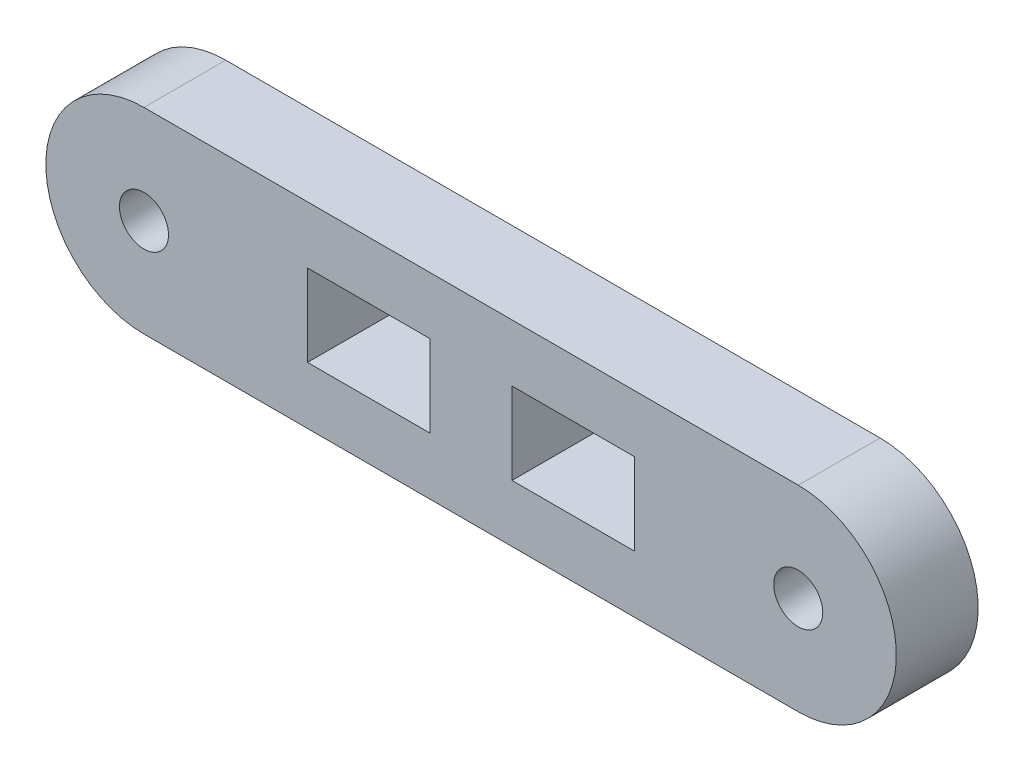
ISO-10303-21;
HEADER;
FILE_DESCRIPTION(('STEP AP214'),'2;1');
FILE_NAME('part.step','',(''),(''),'','','');
FILE_SCHEMA(('AUTOMOTIVE_DESIGN { 1 0 10303 214 1 1 1 1 }'));
ENDSEC;
DATA;
#1=APPLICATION_CONTEXT('core data for automotive mechanical design processes');
#2=APPLICATION_PROTOCOL_DEFINITION('international standard','automotive_design',2000,#1);
#3=PRODUCT_CONTEXT('',#1,'mechanical');
#4=PRODUCT('Part','Part','',(#3));
#5=PRODUCT_RELATED_PRODUCT_CATEGORY('part','',(#4));
#6=PRODUCT_DEFINITION_FORMATION('','',#4);
#7=PRODUCT_DEFINITION_CONTEXT('part definition',#1,'design');
#8=PRODUCT_DEFINITION('design','',#6,#7);
#9=PRODUCT_DEFINITION_SHAPE('','',#8);
#10=(LENGTH_UNIT() NAMED_UNIT(*) SI_UNIT(.MILLI.,.METRE.));
#11=(NAMED_UNIT(*) PLANE_ANGLE_UNIT() SI_UNIT($,.RADIAN.));
#12=(NAMED_UNIT(*) SI_UNIT($,.STERADIAN.) SOLID_ANGLE_UNIT());
#13=UNCERTAINTY_MEASURE_WITH_UNIT(LENGTH_MEASURE(1.E-05),#10,'distance_accuracy_value','');
#14=(GEOMETRIC_REPRESENTATION_CONTEXT(3) GLOBAL_UNCERTAINTY_ASSIGNED_CONTEXT((#13)) GLOBAL_UNIT_ASSIGNED_CONTEXT((#10,
#11,#12)) REPRESENTATION_CONTEXT('',''));
#15=CARTESIAN_POINT('',(0.,0.,0.));
#16=DIRECTION('',(0.,0.,1.));
#17=DIRECTION('',(1.,0.,0.));
#18=AXIS2_PLACEMENT_3D('',#15,#16,#17);
#19=CARTESIAN_POINT('',(40.,0.,5.));
#20=DIRECTION('',(0.,0.,1.));
#21=DIRECTION('',(1.,0.,0.));
#22=AXIS2_PLACEMENT_3D('',#19,#20,#21);
#23=PLANE('',#22);
#24=DIRECTION('',(-1.,0.,0.));
#25=VECTOR('',#24,1.);
#26=CARTESIAN_POINT('',(22.5,2.49999999999998,5.));
#27=LINE('',#26,#25);
#28=CARTESIAN_POINT('',(30.,2.5,5.));
#29=VERTEX_POINT('',#28);
#30=CARTESIAN_POINT('',(22.5,2.49999999999998,5.));
#31=VERTEX_POINT('',#30);
#32=EDGE_CURVE('E160',#29,#31,#27,.T.);
#33=ORIENTED_EDGE('',*,*,#32,.F.);
#34=DIRECTION('',(0.,1.,0.));
#35=VECTOR('',#34,1.);
#36=CARTESIAN_POINT('',(30.,2.5,5.));
#37=LINE('',#36,#35);
#38=CARTESIAN_POINT('',(30.,-2.5,5.));
#39=VERTEX_POINT('',#38);
#40=EDGE_CURVE('E158',#39,#29,#37,.T.);
#41=ORIENTED_EDGE('',*,*,#40,.F.);
#42=DIRECTION('',(1.,0.,0.));
#43=VECTOR('',#42,1.);
#44=CARTESIAN_POINT('',(30.,-2.5,5.));
#45=LINE('',#44,#43);
#46=CARTESIAN_POINT('',(22.5,-2.50000000000002,5.));
#47=VERTEX_POINT('',#46);
#48=EDGE_CURVE('E166',#47,#39,#45,.T.);
#49=ORIENTED_EDGE('',*,*,#48,.F.);
#50=DIRECTION('',(0.,-1.,0.));
#51=VECTOR('',#50,1.);
#52=CARTESIAN_POINT('',(22.5,-2.50000000000002,5.));
#53=LINE('',#52,#51);
#54=EDGE_CURVE('E163',#31,#47,#53,.T.);
#55=ORIENTED_EDGE('',*,*,#54,.F.);
#56=EDGE_LOOP('',(#33,#41,#49,#55));
#57=FACE_BOUND('',#56,.T.);
#58=CARTESIAN_POINT('',(40.,0.,5.));
#59=DIRECTION('',(0.,0.,1.));
#60=DIRECTION('',(1.,0.,0.));
#61=AXIS2_PLACEMENT_3D('',#58,#59,#60);
#62=CIRCLE('',#61,1.49999999999999);
#63=CARTESIAN_POINT('',(41.5,0.,5.));
#64=VERTEX_POINT('',#63);
#65=EDGE_CURVE('E195',#64,#64,#62,.T.);
#66=ORIENTED_EDGE('',*,*,#65,.F.);
#67=EDGE_LOOP('',(#66));
#68=FACE_BOUND('',#67,.T.);
#69=CARTESIAN_POINT('',(40.,0.,5.));
#70=DIRECTION('',(0.,0.,1.));
#71=DIRECTION('',(1.,0.,0.));
#72=AXIS2_PLACEMENT_3D('',#69,#70,#71);
#73=CIRCLE('',#72,5.99999999999999);
#74=CARTESIAN_POINT('',(40.,-5.99999999999999,5.));
#75=VERTEX_POINT('',#74);
#76=CARTESIAN_POINT('',(40.,5.99999999999998,5.));
#77=VERTEX_POINT('',#76);
#78=EDGE_CURVE('E201',#75,#77,#73,.T.);
#79=ORIENTED_EDGE('',*,*,#78,.T.);
#80=DIRECTION('',(-1.,0.,0.));
#81=VECTOR('',#80,1.);
#82=CARTESIAN_POINT('',(40.,5.99999999999998,5.));
#83=LINE('',#82,#81);
#84=CARTESIAN_POINT('',(0.,5.99999999999999,5.));
#85=VERTEX_POINT('',#84);
#86=EDGE_CURVE('E204',#77,#85,#83,.T.);
#87=ORIENTED_EDGE('',*,*,#86,.T.);
#88=CARTESIAN_POINT('',(0.,0.,5.));
#89=DIRECTION('',(0.,0.,1.));
#90=DIRECTION('',(1.,0.,0.));
#91=AXIS2_PLACEMENT_3D('',#88,#89,#90);
#92=CIRCLE('',#91,5.99999999999999);
#93=CARTESIAN_POINT('',(0.,-5.99999999999999,5.));
#94=VERTEX_POINT('',#93);
#95=EDGE_CURVE('E207',#85,#94,#92,.T.);
#96=ORIENTED_EDGE('',*,*,#95,.T.);
#97=DIRECTION('',(1.,0.,0.));
#98=VECTOR('',#97,1.);
#99=CARTESIAN_POINT('',(40.,-5.99999999999999,5.));
#100=LINE('',#99,#98);
#101=EDGE_CURVE('E209',#94,#75,#100,.T.);
#102=ORIENTED_EDGE('',*,*,#101,.T.);
#103=EDGE_LOOP('',(#79,#87,#96,#102));
#104=FACE_BOUND('',#103,.T.);
#105=CARTESIAN_POINT('',(0.,0.,5.));
#106=DIRECTION('',(0.,0.,1.));
#107=DIRECTION('',(1.,0.,0.));
#108=AXIS2_PLACEMENT_3D('',#105,#106,#107);
#109=CIRCLE('',#108,1.50000000000001);
#110=CARTESIAN_POINT('',(1.50000000000001,0.,5.));
#111=VERTEX_POINT('',#110);
#112=EDGE_CURVE('E189',#111,#111,#109,.T.);
#113=ORIENTED_EDGE('',*,*,#112,.F.);
#114=EDGE_LOOP('',(#113));
#115=FACE_BOUND('',#114,.T.);
#116=DIRECTION('',(0.,-1.,0.));
#117=VECTOR('',#116,1.);
#118=CARTESIAN_POINT('',(10.,2.5,5.));
#119=LINE('',#118,#117);
#120=CARTESIAN_POINT('',(10.,2.5,5.));
#121=VERTEX_POINT('',#120);
#122=CARTESIAN_POINT('',(10.,-2.49999999999998,5.));
#123=VERTEX_POINT('',#122);
#124=EDGE_CURVE('E130',#121,#123,#119,.T.);
#125=ORIENTED_EDGE('',*,*,#124,.F.);
#126=DIRECTION('',(-1.,0.,0.));
#127=VECTOR('',#126,1.);
#128=CARTESIAN_POINT('',(17.5,2.5,5.));
#129=LINE('',#128,#127);
#130=CARTESIAN_POINT('',(17.5,2.5,5.));
#131=VERTEX_POINT('',#130);
#132=EDGE_CURVE('E122',#131,#121,#129,.T.);
#133=ORIENTED_EDGE('',*,*,#132,.F.);
#134=DIRECTION('',(0.,1.,0.));
#135=VECTOR('',#134,1.);
#136=CARTESIAN_POINT('',(17.5,-2.50000000000002,5.));
#137=LINE('',#136,#135);
#138=CARTESIAN_POINT('',(17.5,-2.50000000000002,5.));
#139=VERTEX_POINT('',#138);
#140=EDGE_CURVE('E144',#139,#131,#137,.T.);
#141=ORIENTED_EDGE('',*,*,#140,.F.);
#142=DIRECTION('',(1.,0.,0.));
#143=VECTOR('',#142,1.);
#144=CARTESIAN_POINT('',(10.,-2.49999999999998,5.));
#145=LINE('',#144,#143);
#146=EDGE_CURVE('E142',#123,#139,#145,.T.);
#147=ORIENTED_EDGE('',*,*,#146,.F.);
#148=EDGE_LOOP('',(#125,#133,#141,#147));
#149=FACE_BOUND('',#148,.T.);
#150=ADVANCED_FACE('F33',(#57,#68,#104,#115,#149),#23,.T.);
#151=CARTESIAN_POINT('',(40.,0.,0.));
#152=DIRECTION('',(0.,0.,1.));
#153=DIRECTION('',(1.,0.,0.));
#154=AXIS2_PLACEMENT_3D('',#151,#152,#153);
#155=PLANE('',#154);
#156=DIRECTION('',(0.,1.,0.));
#157=VECTOR('',#156,1.);
#158=CARTESIAN_POINT('',(30.,2.5,0.));
#159=LINE('',#158,#157);
#160=CARTESIAN_POINT('',(30.,-2.5,0.));
#161=VERTEX_POINT('',#160);
#162=CARTESIAN_POINT('',(30.,2.5,0.));
#163=VERTEX_POINT('',#162);
#164=EDGE_CURVE('E138',#161,#163,#159,.T.);
#165=ORIENTED_EDGE('',*,*,#164,.T.);
#166=DIRECTION('',(-1.,0.,0.));
#167=VECTOR('',#166,1.);
#168=CARTESIAN_POINT('',(22.5,2.49999999999998,0.));
#169=LINE('',#168,#167);
#170=CARTESIAN_POINT('',(22.5,2.49999999999998,0.));
#171=VERTEX_POINT('',#170);
#172=EDGE_CURVE('E171',#163,#171,#169,.T.);
#173=ORIENTED_EDGE('',*,*,#172,.T.);
#174=DIRECTION('',(0.,-1.,0.));
#175=VECTOR('',#174,1.);
#176=CARTESIAN_POINT('',(22.5,-2.50000000000002,0.));
#177=LINE('',#176,#175);
#178=CARTESIAN_POINT('',(22.5,-2.50000000000002,0.));
#179=VERTEX_POINT('',#178);
#180=EDGE_CURVE('E174',#171,#179,#177,.T.);
#181=ORIENTED_EDGE('',*,*,#180,.T.);
#182=DIRECTION('',(1.,0.,0.));
#183=VECTOR('',#182,1.);
#184=CARTESIAN_POINT('',(30.,-2.5,0.));
#185=LINE('',#184,#183);
#186=EDGE_CURVE('E161',#179,#161,#185,.T.);
#187=ORIENTED_EDGE('',*,*,#186,.T.);
#188=EDGE_LOOP('',(#165,#173,#181,#187));
#189=FACE_BOUND('',#188,.T.);
#190=CARTESIAN_POINT('',(40.,0.,0.));
#191=DIRECTION('',(0.,0.,1.));
#192=DIRECTION('',(1.,0.,0.));
#193=AXIS2_PLACEMENT_3D('',#190,#191,#192);
#194=CIRCLE('',#193,1.49999999999999);
#195=CARTESIAN_POINT('',(41.5,0.,0.));
#196=VERTEX_POINT('',#195);
#197=EDGE_CURVE('E192',#196,#196,#194,.T.);
#198=ORIENTED_EDGE('',*,*,#197,.T.);
#199=EDGE_LOOP('',(#198));
#200=FACE_BOUND('',#199,.T.);
#201=CARTESIAN_POINT('',(40.,0.,0.));
#202=DIRECTION('',(0.,0.,1.));
#203=DIRECTION('',(1.,0.,0.));
#204=AXIS2_PLACEMENT_3D('',#201,#202,#203);
#205=CIRCLE('',#204,5.99999999999999);
#206=CARTESIAN_POINT('',(40.,-5.99999999999999,0.));
#207=VERTEX_POINT('',#206);
#208=CARTESIAN_POINT('',(40.,5.99999999999998,0.));
#209=VERTEX_POINT('',#208);
#210=EDGE_CURVE('E198',#207,#209,#205,.T.);
#211=ORIENTED_EDGE('',*,*,#210,.F.);
#212=DIRECTION('',(1.,0.,0.));
#213=VECTOR('',#212,1.);
#214=CARTESIAN_POINT('',(40.,-5.99999999999999,0.));
#215=LINE('',#214,#213);
#216=CARTESIAN_POINT('',(0.,-5.99999999999999,0.));
#217=VERTEX_POINT('',#216);
#218=EDGE_CURVE('E205',#217,#207,#215,.T.);
#219=ORIENTED_EDGE('',*,*,#218,.F.);
#220=CARTESIAN_POINT('',(0.,0.,0.));
#221=DIRECTION('',(0.,0.,1.));
#222=DIRECTION('',(1.,0.,0.));
#223=AXIS2_PLACEMENT_3D('',#220,#221,#222);
#224=CIRCLE('',#223,5.99999999999999);
#225=CARTESIAN_POINT('',(0.,5.99999999999999,0.));
#226=VERTEX_POINT('',#225);
#227=EDGE_CURVE('E216',#226,#217,#224,.T.);
#228=ORIENTED_EDGE('',*,*,#227,.F.);
#229=DIRECTION('',(-1.,0.,0.));
#230=VECTOR('',#229,1.);
#231=CARTESIAN_POINT('',(40.,5.99999999999998,0.));
#232=LINE('',#231,#230);
#233=EDGE_CURVE('E214',#209,#226,#232,.T.);
#234=ORIENTED_EDGE('',*,*,#233,.F.);
#235=EDGE_LOOP('',(#211,#219,#228,#234));
#236=FACE_BOUND('',#235,.T.);
#237=CARTESIAN_POINT('',(0.,0.,0.));
#238=DIRECTION('',(0.,0.,1.));
#239=DIRECTION('',(1.,0.,0.));
#240=AXIS2_PLACEMENT_3D('',#237,#238,#239);
#241=CIRCLE('',#240,1.50000000000001);
#242=CARTESIAN_POINT('',(1.50000000000001,0.,0.));
#243=VERTEX_POINT('',#242);
#244=EDGE_CURVE('E188',#243,#243,#241,.T.);
#245=ORIENTED_EDGE('',*,*,#244,.T.);
#246=EDGE_LOOP('',(#245));
#247=FACE_BOUND('',#246,.T.);
#248=DIRECTION('',(-1.,0.,0.));
#249=VECTOR('',#248,1.);
#250=CARTESIAN_POINT('',(17.5,2.5,0.));
#251=LINE('',#250,#249);
#252=CARTESIAN_POINT('',(17.5,2.5,0.));
#253=VERTEX_POINT('',#252);
#254=CARTESIAN_POINT('',(10.,2.5,0.));
#255=VERTEX_POINT('',#254);
#256=EDGE_CURVE('E56',#253,#255,#251,.T.);
#257=ORIENTED_EDGE('',*,*,#256,.T.);
#258=DIRECTION('',(0.,-1.,0.));
#259=VECTOR('',#258,1.);
#260=CARTESIAN_POINT('',(10.,2.5,0.));
#261=LINE('',#260,#259);
#262=CARTESIAN_POINT('',(10.,-2.49999999999998,0.));
#263=VERTEX_POINT('',#262);
#264=EDGE_CURVE('E137',#255,#263,#261,.T.);
#265=ORIENTED_EDGE('',*,*,#264,.T.);
#266=DIRECTION('',(1.,0.,0.));
#267=VECTOR('',#266,1.);
#268=CARTESIAN_POINT('',(10.,-2.49999999999998,0.));
#269=LINE('',#268,#267);
#270=CARTESIAN_POINT('',(17.5,-2.50000000000002,0.));
#271=VERTEX_POINT('',#270);
#272=EDGE_CURVE('E150',#263,#271,#269,.T.);
#273=ORIENTED_EDGE('',*,*,#272,.T.);
#274=DIRECTION('',(0.,1.,0.));
#275=VECTOR('',#274,1.);
#276=CARTESIAN_POINT('',(17.5,-2.50000000000002,0.));
#277=LINE('',#276,#275);
#278=EDGE_CURVE('E131',#271,#253,#277,.T.);
#279=ORIENTED_EDGE('',*,*,#278,.T.);
#280=EDGE_LOOP('',(#257,#265,#273,#279));
#281=FACE_BOUND('',#280,.T.);
#282=ADVANCED_FACE('F234',(#189,#200,#236,#247,#281),#155,.F.);
#283=CARTESIAN_POINT('',(40.,0.,5.));
#284=DIRECTION('',(0.,0.,-1.));
#285=DIRECTION('',(-1.,0.,0.));
#286=AXIS2_PLACEMENT_3D('',#283,#284,#285);
#287=CYLINDRICAL_SURFACE('',#286,5.99999999999999);
#288=ORIENTED_EDGE('',*,*,#210,.T.);
#289=DIRECTION('',(0.,0.,-1.));
#290=VECTOR('',#289,1.);
#291=CARTESIAN_POINT('',(40.,5.99999999999998,5.));
#292=LINE('',#291,#290);
#293=EDGE_CURVE('E11',#77,#209,#292,.T.);
#294=ORIENTED_EDGE('',*,*,#293,.F.);
#295=ORIENTED_EDGE('',*,*,#78,.F.);
#296=DIRECTION('',(0.,0.,-1.));
#297=VECTOR('',#296,1.);
#298=CARTESIAN_POINT('',(40.,-5.99999999999999,5.));
#299=LINE('',#298,#297);
#300=EDGE_CURVE('E211',#75,#207,#299,.T.);
#301=ORIENTED_EDGE('',*,*,#300,.T.);
#302=EDGE_LOOP('',(#288,#294,#295,#301));
#303=FACE_BOUND('',#302,.T.);
#304=ADVANCED_FACE('F35',(#303),#287,.T.);
#305=CARTESIAN_POINT('',(40.,5.99999999999998,5.));
#306=DIRECTION('',(0.,-1.,0.));
#307=DIRECTION('',(1.,0.,0.));
#308=AXIS2_PLACEMENT_3D('',#305,#306,#307);
#309=PLANE('',#308);
#310=ORIENTED_EDGE('',*,*,#233,.T.);
#311=DIRECTION('',(0.,0.,-1.));
#312=VECTOR('',#311,1.);
#313=CARTESIAN_POINT('',(0.,5.99999999999999,5.));
#314=LINE('',#313,#312);
#315=EDGE_CURVE('E41',#85,#226,#314,.T.);
#316=ORIENTED_EDGE('',*,*,#315,.F.);
#317=ORIENTED_EDGE('',*,*,#86,.F.);
#318=ORIENTED_EDGE('',*,*,#293,.T.);
#319=EDGE_LOOP('',(#310,#316,#317,#318));
#320=FACE_BOUND('',#319,.T.);
#321=ADVANCED_FACE('F245',(#320),#309,.F.);
#322=CARTESIAN_POINT('',(0.,0.,5.));
#323=DIRECTION('',(0.,0.,-1.));
#324=DIRECTION('',(-1.,0.,0.));
#325=AXIS2_PLACEMENT_3D('',#322,#323,#324);
#326=CYLINDRICAL_SURFACE('',#325,5.99999999999999);
#327=ORIENTED_EDGE('',*,*,#227,.T.);
#328=DIRECTION('',(0.,0.,-1.));
#329=VECTOR('',#328,1.);
#330=CARTESIAN_POINT('',(0.,-5.99999999999999,5.));
#331=LINE('',#330,#329);
#332=EDGE_CURVE('E221',#94,#217,#331,.T.);
#333=ORIENTED_EDGE('',*,*,#332,.F.);
#334=ORIENTED_EDGE('',*,*,#95,.F.);
#335=ORIENTED_EDGE('',*,*,#315,.T.);
#336=EDGE_LOOP('',(#327,#333,#334,#335));
#337=FACE_BOUND('',#336,.T.);
#338=ADVANCED_FACE('F228',(#337),#326,.T.);
#339=CARTESIAN_POINT('',(40.,-5.99999999999999,5.));
#340=DIRECTION('',(0.,1.,0.));
#341=DIRECTION('',(-1.,0.,0.));
#342=AXIS2_PLACEMENT_3D('',#339,#340,#341);
#343=PLANE('',#342);
#344=ORIENTED_EDGE('',*,*,#218,.T.);
#345=ORIENTED_EDGE('',*,*,#300,.F.);
#346=ORIENTED_EDGE('',*,*,#101,.F.);
#347=ORIENTED_EDGE('',*,*,#332,.T.);
#348=EDGE_LOOP('',(#344,#345,#346,#347));
#349=FACE_BOUND('',#348,.T.);
#350=ADVANCED_FACE('F238',(#349),#343,.F.);
#351=CARTESIAN_POINT('',(40.,0.,5.));
#352=DIRECTION('',(0.,0.,-1.));
#353=DIRECTION('',(-1.,0.,0.));
#354=AXIS2_PLACEMENT_3D('',#351,#352,#353);
#355=CYLINDRICAL_SURFACE('',#354,1.49999999999999);
#356=ORIENTED_EDGE('',*,*,#65,.T.);
#357=EDGE_LOOP('',(#356));
#358=FACE_BOUND('',#357,.T.);
#359=ORIENTED_EDGE('',*,*,#197,.F.);
#360=EDGE_LOOP('',(#359));
#361=FACE_BOUND('',#360,.T.);
#362=ADVANCED_FACE('F263',(#358,#361),#355,.F.);
#363=CARTESIAN_POINT('',(0.,0.,5.));
#364=DIRECTION('',(0.,0.,-1.));
#365=DIRECTION('',(-1.,0.,0.));
#366=AXIS2_PLACEMENT_3D('',#363,#364,#365);
#367=CYLINDRICAL_SURFACE('',#366,1.50000000000001);
#368=ORIENTED_EDGE('',*,*,#112,.T.);
#369=EDGE_LOOP('',(#368));
#370=FACE_BOUND('',#369,.T.);
#371=ORIENTED_EDGE('',*,*,#244,.F.);
#372=EDGE_LOOP('',(#371));
#373=FACE_BOUND('',#372,.T.);
#374=ADVANCED_FACE('F270',(#370,#373),#367,.F.);
#375=CARTESIAN_POINT('',(30.,2.5,5.));
#376=DIRECTION('',(-1.,0.,0.));
#377=DIRECTION('',(0.,0.,1.));
#378=AXIS2_PLACEMENT_3D('',#375,#376,#377);
#379=PLANE('',#378);
#380=ORIENTED_EDGE('',*,*,#164,.F.);
#381=DIRECTION('',(0.,0.,-1.));
#382=VECTOR('',#381,1.);
#383=CARTESIAN_POINT('',(30.,-2.5,5.));
#384=LINE('',#383,#382);
#385=EDGE_CURVE('E168',#39,#161,#384,.T.);
#386=ORIENTED_EDGE('',*,*,#385,.F.);
#387=ORIENTED_EDGE('',*,*,#40,.T.);
#388=DIRECTION('',(0.,0.,-1.));
#389=VECTOR('',#388,1.);
#390=CARTESIAN_POINT('',(30.,2.5,5.));
#391=LINE('',#390,#389);
#392=EDGE_CURVE('E185',#29,#163,#391,.T.);
#393=ORIENTED_EDGE('',*,*,#392,.T.);
#394=EDGE_LOOP('',(#380,#386,#387,#393));
#395=FACE_BOUND('',#394,.T.);
#396=ADVANCED_FACE('F275',(#395),#379,.T.);
#397=CARTESIAN_POINT('',(22.5,2.49999999999998,5.));
#398=DIRECTION('',(0.,-1.,0.));
#399=DIRECTION('',(1.,0.,0.));
#400=AXIS2_PLACEMENT_3D('',#397,#398,#399);
#401=PLANE('',#400);
#402=ORIENTED_EDGE('',*,*,#172,.F.);
#403=ORIENTED_EDGE('',*,*,#392,.F.);
#404=ORIENTED_EDGE('',*,*,#32,.T.);
#405=DIRECTION('',(0.,0.,-1.));
#406=VECTOR('',#405,1.);
#407=CARTESIAN_POINT('',(22.5,2.49999999999998,5.));
#408=LINE('',#407,#406);
#409=EDGE_CURVE('E183',#31,#171,#408,.T.);
#410=ORIENTED_EDGE('',*,*,#409,.T.);
#411=EDGE_LOOP('',(#402,#403,#404,#410));
#412=FACE_BOUND('',#411,.T.);
#413=ADVANCED_FACE('F284',(#412),#401,.T.);
#414=CARTESIAN_POINT('',(22.5,-2.50000000000002,5.));
#415=DIRECTION('',(1.,0.,0.));
#416=DIRECTION('',(0.,0.,-1.));
#417=AXIS2_PLACEMENT_3D('',#414,#415,#416);
#418=PLANE('',#417);
#419=ORIENTED_EDGE('',*,*,#180,.F.);
#420=ORIENTED_EDGE('',*,*,#409,.F.);
#421=ORIENTED_EDGE('',*,*,#54,.T.);
#422=DIRECTION('',(0.,0.,-1.));
#423=VECTOR('',#422,1.);
#424=CARTESIAN_POINT('',(22.5,-2.50000000000002,5.));
#425=LINE('',#424,#423);
#426=EDGE_CURVE('E181',#47,#179,#425,.T.);
#427=ORIENTED_EDGE('',*,*,#426,.T.);
#428=EDGE_LOOP('',(#419,#420,#421,#427));
#429=FACE_BOUND('',#428,.T.);
#430=ADVANCED_FACE('F291',(#429),#418,.T.);
#431=CARTESIAN_POINT('',(30.,-2.5,5.));
#432=DIRECTION('',(0.,1.,0.));
#433=DIRECTION('',(-1.,0.,0.));
#434=AXIS2_PLACEMENT_3D('',#431,#432,#433);
#435=PLANE('',#434);
#436=ORIENTED_EDGE('',*,*,#186,.F.);
#437=ORIENTED_EDGE('',*,*,#426,.F.);
#438=ORIENTED_EDGE('',*,*,#48,.T.);
#439=ORIENTED_EDGE('',*,*,#385,.T.);
#440=EDGE_LOOP('',(#436,#437,#438,#439));
#441=FACE_BOUND('',#440,.T.);
#442=ADVANCED_FACE('F295',(#441),#435,.T.);
#443=CARTESIAN_POINT('',(17.5,2.5,5.));
#444=DIRECTION('',(0.,-1.,0.));
#445=DIRECTION('',(1.,0.,0.));
#446=AXIS2_PLACEMENT_3D('',#443,#444,#445);
#447=PLANE('',#446);
#448=ORIENTED_EDGE('',*,*,#256,.F.);
#449=DIRECTION('',(0.,0.,-1.));
#450=VECTOR('',#449,1.);
#451=CARTESIAN_POINT('',(17.5,2.5,5.));
#452=LINE('',#451,#450);
#453=EDGE_CURVE('E126',#131,#253,#452,.T.);
#454=ORIENTED_EDGE('',*,*,#453,.F.);
#455=ORIENTED_EDGE('',*,*,#132,.T.);
#456=DIRECTION('',(0.,0.,-1.));
#457=VECTOR('',#456,1.);
#458=CARTESIAN_POINT('',(10.,2.5,5.));
#459=LINE('',#458,#457);
#460=EDGE_CURVE('E125',#121,#255,#459,.T.);
#461=ORIENTED_EDGE('',*,*,#460,.T.);
#462=EDGE_LOOP('',(#448,#454,#455,#461));
#463=FACE_BOUND('',#462,.T.);
#464=ADVANCED_FACE('F124',(#463),#447,.T.);
#465=CARTESIAN_POINT('',(10.,2.5,5.));
#466=DIRECTION('',(1.,0.,0.));
#467=DIRECTION('',(0.,1.,0.));
#468=AXIS2_PLACEMENT_3D('',#465,#466,#467);
#469=PLANE('',#468);
#470=ORIENTED_EDGE('',*,*,#264,.F.);
#471=ORIENTED_EDGE('',*,*,#460,.F.);
#472=ORIENTED_EDGE('',*,*,#124,.T.);
#473=DIRECTION('',(0.,0.,-1.));
#474=VECTOR('',#473,1.);
#475=CARTESIAN_POINT('',(10.,-2.49999999999998,5.));
#476=LINE('',#475,#474);
#477=EDGE_CURVE('E139',#123,#263,#476,.T.);
#478=ORIENTED_EDGE('',*,*,#477,.T.);
#479=EDGE_LOOP('',(#470,#471,#472,#478));
#480=FACE_BOUND('',#479,.T.);
#481=ADVANCED_FACE('F134',(#480),#469,.T.);
#482=CARTESIAN_POINT('',(10.,-2.49999999999998,5.));
#483=DIRECTION('',(0.,1.,0.));
#484=DIRECTION('',(-1.,0.,0.));
#485=AXIS2_PLACEMENT_3D('',#482,#483,#484);
#486=PLANE('',#485);
#487=ORIENTED_EDGE('',*,*,#272,.F.);
#488=ORIENTED_EDGE('',*,*,#477,.F.);
#489=ORIENTED_EDGE('',*,*,#146,.T.);
#490=DIRECTION('',(0.,0.,-1.));
#491=VECTOR('',#490,1.);
#492=CARTESIAN_POINT('',(17.5,-2.50000000000002,5.));
#493=LINE('',#492,#491);
#494=EDGE_CURVE('E48',#139,#271,#493,.T.);
#495=ORIENTED_EDGE('',*,*,#494,.T.);
#496=EDGE_LOOP('',(#487,#488,#489,#495));
#497=FACE_BOUND('',#496,.T.);
#498=ADVANCED_FACE('F304',(#497),#486,.T.);
#499=CARTESIAN_POINT('',(17.5,-2.50000000000002,5.));
#500=DIRECTION('',(-1.,0.,0.));
#501=DIRECTION('',(0.,-1.,0.));
#502=AXIS2_PLACEMENT_3D('',#499,#500,#501);
#503=PLANE('',#502);
#504=ORIENTED_EDGE('',*,*,#278,.F.);
#505=ORIENTED_EDGE('',*,*,#494,.F.);
#506=ORIENTED_EDGE('',*,*,#140,.T.);
#507=ORIENTED_EDGE('',*,*,#453,.T.);
#508=EDGE_LOOP('',(#504,#505,#506,#507));
#509=FACE_BOUND('',#508,.T.);
#510=ADVANCED_FACE('F307',(#509),#503,.T.);
#511=CLOSED_SHELL('',(#150,#282,#304,#321,#338,#350,#362,#374,#396,#413,#430,#442,#464,#481,
#498,#510));
#512=MANIFOLD_SOLID_BREP('B2',#511);
#513=ADVANCED_BREP_SHAPE_REPRESENTATION('',(#18,#512),#14);
#514=SHAPE_DEFINITION_REPRESENTATION(#9,#513);
ENDSEC;
END-ISO-10303-21;
